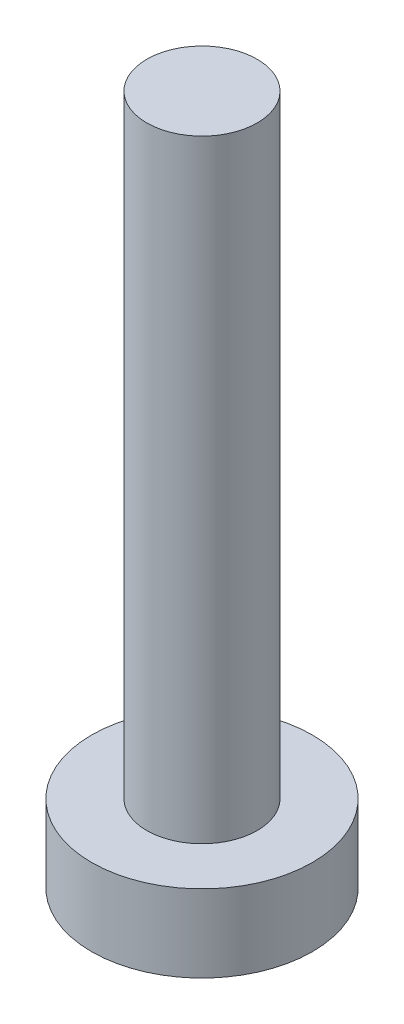
ISO-10303-21;
HEADER;
FILE_DESCRIPTION(('STEP AP214'),'2;1');
FILE_NAME('part.step','',(''),(''),'','','');
FILE_SCHEMA(('AUTOMOTIVE_DESIGN { 1 0 10303 214 1 1 1 1 }'));
ENDSEC;
DATA;
#1=APPLICATION_CONTEXT('core data for automotive mechanical design processes');
#2=APPLICATION_PROTOCOL_DEFINITION('international standard','automotive_design',2000,#1);
#3=PRODUCT_CONTEXT('',#1,'mechanical');
#4=PRODUCT('Part','Part','',(#3));
#5=PRODUCT_RELATED_PRODUCT_CATEGORY('part','',(#4));
#6=PRODUCT_DEFINITION_FORMATION('','',#4);
#7=PRODUCT_DEFINITION_CONTEXT('part definition',#1,'design');
#8=PRODUCT_DEFINITION('design','',#6,#7);
#9=PRODUCT_DEFINITION_SHAPE('','',#8);
#10=(LENGTH_UNIT() NAMED_UNIT(*) SI_UNIT(.MILLI.,.METRE.));
#11=(NAMED_UNIT(*) PLANE_ANGLE_UNIT() SI_UNIT($,.RADIAN.));
#12=(NAMED_UNIT(*) SI_UNIT($,.STERADIAN.) SOLID_ANGLE_UNIT());
#13=UNCERTAINTY_MEASURE_WITH_UNIT(LENGTH_MEASURE(1.E-05),#10,'distance_accuracy_value','');
#14=(GEOMETRIC_REPRESENTATION_CONTEXT(3) GLOBAL_UNCERTAINTY_ASSIGNED_CONTEXT((#13)) GLOBAL_UNIT_ASSIGNED_CONTEXT((#10,
#11,#12)) REPRESENTATION_CONTEXT('',''));
#15=CARTESIAN_POINT('',(0.,0.,0.));
#16=DIRECTION('',(0.,0.,1.));
#17=DIRECTION('',(1.,0.,0.));
#18=AXIS2_PLACEMENT_3D('',#15,#16,#17);
#19=CARTESIAN_POINT('',(0.,2.8,0.));
#20=DIRECTION('',(0.,1.,0.));
#21=DIRECTION('',(0.,0.,1.));
#22=AXIS2_PLACEMENT_3D('',#19,#20,#21);
#23=PLANE('',#22);
#24=CARTESIAN_POINT('',(0.,2.8,0.));
#25=DIRECTION('',(0.,1.,0.));
#26=DIRECTION('',(0.,0.,1.));
#27=AXIS2_PLACEMENT_3D('',#24,#25,#26);
#28=CIRCLE('',#27,4.);
#29=CARTESIAN_POINT('',(0.,2.8,4.));
#30=VERTEX_POINT('',#29);
#31=EDGE_CURVE('E10',#30,#30,#28,.T.);
#32=ORIENTED_EDGE('',*,*,#31,.T.);
#33=EDGE_LOOP('',(#32));
#34=FACE_BOUND('',#33,.T.);
#35=CARTESIAN_POINT('',(0.,2.8,0.));
#36=DIRECTION('',(0.,1.,0.));
#37=DIRECTION('',(0.,0.,1.));
#38=AXIS2_PLACEMENT_3D('',#35,#36,#37);
#39=CIRCLE('',#38,2.);
#40=CARTESIAN_POINT('',(0.,2.8,2.));
#41=VERTEX_POINT('',#40);
#42=EDGE_CURVE('E57',#41,#41,#39,.T.);
#43=ORIENTED_EDGE('',*,*,#42,.F.);
#44=EDGE_LOOP('',(#43));
#45=FACE_BOUND('',#44,.T.);
#46=ADVANCED_FACE('F43',(#34,#45),#23,.T.);
#47=CARTESIAN_POINT('',(0.,0.,0.));
#48=DIRECTION('',(0.,1.,0.));
#49=DIRECTION('',(0.,0.,1.));
#50=AXIS2_PLACEMENT_3D('',#47,#48,#49);
#51=PLANE('',#50);
#52=CARTESIAN_POINT('',(0.,0.,0.));
#53=DIRECTION('',(0.,1.,0.));
#54=DIRECTION('',(0.,0.,1.));
#55=AXIS2_PLACEMENT_3D('',#52,#53,#54);
#56=CIRCLE('',#55,4.);
#57=CARTESIAN_POINT('',(0.,0.,4.));
#58=VERTEX_POINT('',#57);
#59=EDGE_CURVE('E50',#58,#58,#56,.T.);
#60=ORIENTED_EDGE('',*,*,#59,.F.);
#61=EDGE_LOOP('',(#60));
#62=FACE_BOUND('',#61,.T.);
#63=ADVANCED_FACE('F77',(#62),#51,.F.);
#64=CARTESIAN_POINT('',(0.,2.8,0.));
#65=DIRECTION('',(0.,-1.,0.));
#66=DIRECTION('',(0.,0.,-1.));
#67=AXIS2_PLACEMENT_3D('',#64,#65,#66);
#68=CYLINDRICAL_SURFACE('',#67,4.);
#69=ORIENTED_EDGE('',*,*,#31,.F.);
#70=EDGE_LOOP('',(#69));
#71=FACE_BOUND('',#70,.T.);
#72=ORIENTED_EDGE('',*,*,#59,.T.);
#73=EDGE_LOOP('',(#72));
#74=FACE_BOUND('',#73,.T.);
#75=ADVANCED_FACE('F44',(#71,#74),#68,.T.);
#76=CARTESIAN_POINT('',(0.,25.,0.));
#77=DIRECTION('',(0.,-1.,0.));
#78=DIRECTION('',(0.,0.,-1.));
#79=AXIS2_PLACEMENT_3D('',#76,#77,#78);
#80=CYLINDRICAL_SURFACE('',#79,2.);
#81=ORIENTED_EDGE('',*,*,#42,.T.);
#82=EDGE_LOOP('',(#81));
#83=FACE_BOUND('',#82,.T.);
#84=CARTESIAN_POINT('',(0.,25.,0.));
#85=DIRECTION('',(0.,1.,0.));
#86=DIRECTION('',(0.,0.,1.));
#87=AXIS2_PLACEMENT_3D('',#84,#85,#86);
#88=CIRCLE('',#87,2.);
#89=CARTESIAN_POINT('',(0.,25.,2.));
#90=VERTEX_POINT('',#89);
#91=EDGE_CURVE('E63',#90,#90,#88,.T.);
#92=ORIENTED_EDGE('',*,*,#91,.F.);
#93=EDGE_LOOP('',(#92));
#94=FACE_BOUND('',#93,.T.);
#95=ADVANCED_FACE('F68',(#83,#94),#80,.T.);
#96=CARTESIAN_POINT('',(0.,25.,0.));
#97=DIRECTION('',(0.,1.,0.));
#98=DIRECTION('',(0.,0.,1.));
#99=AXIS2_PLACEMENT_3D('',#96,#97,#98);
#100=PLANE('',#99);
#101=ORIENTED_EDGE('',*,*,#91,.T.);
#102=EDGE_LOOP('',(#101));
#103=FACE_BOUND('',#102,.T.);
#104=ADVANCED_FACE('F67',(#103),#100,.T.);
#105=CLOSED_SHELL('',(#46,#63,#75,#95,#104));
#106=MANIFOLD_SOLID_BREP('B2',#105);
#107=ADVANCED_BREP_SHAPE_REPRESENTATION('',(#18,#106),#14);
#108=SHAPE_DEFINITION_REPRESENTATION(#9,#107);
ENDSEC;
END-ISO-10303-21;
